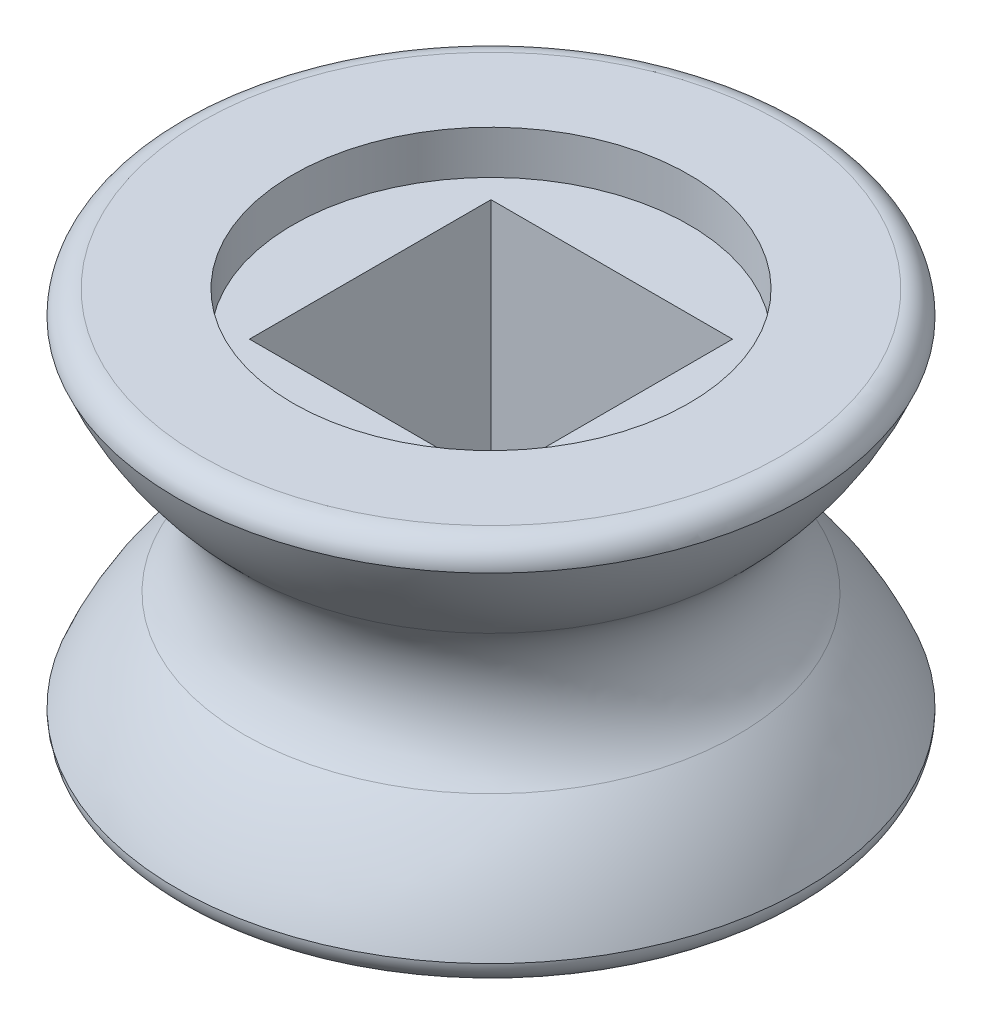
ISO-10303-21;
HEADER;
FILE_DESCRIPTION(('STEP AP214'),'2;1');
FILE_NAME('part.step','',(''),(''),'','','');
FILE_SCHEMA(('AUTOMOTIVE_DESIGN { 1 0 10303 214 1 1 1 1 }'));
ENDSEC;
DATA;
#1=APPLICATION_CONTEXT('core data for automotive mechanical design processes');
#2=APPLICATION_PROTOCOL_DEFINITION('international standard','automotive_design',2000,#1);
#3=PRODUCT_CONTEXT('',#1,'mechanical');
#4=PRODUCT('Part','Part','',(#3));
#5=PRODUCT_RELATED_PRODUCT_CATEGORY('part','',(#4));
#6=PRODUCT_DEFINITION_FORMATION('','',#4);
#7=PRODUCT_DEFINITION_CONTEXT('part definition',#1,'design');
#8=PRODUCT_DEFINITION('design','',#6,#7);
#9=PRODUCT_DEFINITION_SHAPE('','',#8);
#10=(LENGTH_UNIT() NAMED_UNIT(*) SI_UNIT(.MILLI.,.METRE.));
#11=(NAMED_UNIT(*) PLANE_ANGLE_UNIT() SI_UNIT($,.RADIAN.));
#12=(NAMED_UNIT(*) SI_UNIT($,.STERADIAN.) SOLID_ANGLE_UNIT());
#13=UNCERTAINTY_MEASURE_WITH_UNIT(LENGTH_MEASURE(1.E-05),#10,'distance_accuracy_value','');
#14=(GEOMETRIC_REPRESENTATION_CONTEXT(3) GLOBAL_UNCERTAINTY_ASSIGNED_CONTEXT((#13)) GLOBAL_UNIT_ASSIGNED_CONTEXT((#10,
#11,#12)) REPRESENTATION_CONTEXT('',''));
#15=CARTESIAN_POINT('',(0.,0.,0.));
#16=DIRECTION('',(0.,0.,1.));
#17=DIRECTION('',(1.,0.,0.));
#18=AXIS2_PLACEMENT_3D('',#15,#16,#17);
#19=CARTESIAN_POINT('',(3.175,-5.08,3.175));
#20=DIRECTION('',(1.,0.,0.));
#21=DIRECTION('',(0.,0.,-1.));
#22=AXIS2_PLACEMENT_3D('',#19,#20,#21);
#23=PLANE('',#22);
#24=DIRECTION('',(0.,0.,-1.));
#25=VECTOR('',#24,1.);
#26=CARTESIAN_POINT('',(3.175,-3.937,3.175));
#27=LINE('',#26,#25);
#28=CARTESIAN_POINT('',(3.175,-3.937,3.175));
#29=VERTEX_POINT('',#28);
#30=CARTESIAN_POINT('',(3.175,-3.937,-3.175));
#31=VERTEX_POINT('',#30);
#32=EDGE_CURVE('E58',#29,#31,#27,.T.);
#33=ORIENTED_EDGE('',*,*,#32,.F.);
#34=DIRECTION('',(0.,1.,0.));
#35=VECTOR('',#34,1.);
#36=CARTESIAN_POINT('',(3.175,-5.08,3.175));
#37=LINE('',#36,#35);
#38=CARTESIAN_POINT('',(3.175,3.937,3.175));
#39=VERTEX_POINT('',#38);
#40=EDGE_CURVE('E108',#29,#39,#37,.T.);
#41=ORIENTED_EDGE('',*,*,#40,.T.);
#42=DIRECTION('',(0.,0.,1.));
#43=VECTOR('',#42,1.);
#44=CARTESIAN_POINT('',(3.175,3.937,3.175));
#45=LINE('',#44,#43);
#46=CARTESIAN_POINT('',(3.175,3.937,-3.175));
#47=VERTEX_POINT('',#46);
#48=EDGE_CURVE('E110',#47,#39,#45,.T.);
#49=ORIENTED_EDGE('',*,*,#48,.F.);
#50=DIRECTION('',(0.,1.,0.));
#51=VECTOR('',#50,1.);
#52=CARTESIAN_POINT('',(3.175,-5.08,-3.175));
#53=LINE('',#52,#51);
#54=EDGE_CURVE('E104',#31,#47,#53,.T.);
#55=ORIENTED_EDGE('',*,*,#54,.F.);
#56=EDGE_LOOP('',(#33,#41,#49,#55));
#57=FACE_BOUND('',#56,.T.);
#58=ADVANCED_FACE('F42',(#57),#23,.F.);
#59=CARTESIAN_POINT('',(-3.175,-5.08,3.175));
#60=DIRECTION('',(0.,0.,1.));
#61=DIRECTION('',(1.,0.,0.));
#62=AXIS2_PLACEMENT_3D('',#59,#60,#61);
#63=PLANE('',#62);
#64=DIRECTION('',(1.,0.,0.));
#65=VECTOR('',#64,1.);
#66=CARTESIAN_POINT('',(-3.175,-3.937,3.175));
#67=LINE('',#66,#65);
#68=CARTESIAN_POINT('',(-3.175,-3.937,3.175));
#69=VERTEX_POINT('',#68);
#70=EDGE_CURVE('E97',#69,#29,#67,.T.);
#71=ORIENTED_EDGE('',*,*,#70,.F.);
#72=DIRECTION('',(0.,1.,0.));
#73=VECTOR('',#72,1.);
#74=CARTESIAN_POINT('',(-3.175,-5.08,3.175));
#75=LINE('',#74,#73);
#76=CARTESIAN_POINT('',(-3.175,3.937,3.175));
#77=VERTEX_POINT('',#76);
#78=EDGE_CURVE('E95',#69,#77,#75,.T.);
#79=ORIENTED_EDGE('',*,*,#78,.T.);
#80=DIRECTION('',(-1.,0.,0.));
#81=VECTOR('',#80,1.);
#82=CARTESIAN_POINT('',(-3.175,3.937,3.175));
#83=LINE('',#82,#81);
#84=EDGE_CURVE('E197',#39,#77,#83,.T.);
#85=ORIENTED_EDGE('',*,*,#84,.F.);
#86=ORIENTED_EDGE('',*,*,#40,.F.);
#87=EDGE_LOOP('',(#71,#79,#85,#86));
#88=FACE_BOUND('',#87,.T.);
#89=ADVANCED_FACE('F145',(#88),#63,.F.);
#90=CARTESIAN_POINT('',(-3.175,-5.08,3.175));
#91=DIRECTION('',(-1.,0.,0.));
#92=DIRECTION('',(0.,0.,1.));
#93=AXIS2_PLACEMENT_3D('',#90,#91,#92);
#94=PLANE('',#93);
#95=DIRECTION('',(0.,0.,1.));
#96=VECTOR('',#95,1.);
#97=CARTESIAN_POINT('',(-3.175,-3.937,3.175));
#98=LINE('',#97,#96);
#99=CARTESIAN_POINT('',(-3.175,-3.937,-3.175));
#100=VERTEX_POINT('',#99);
#101=EDGE_CURVE('E85',#100,#69,#98,.T.);
#102=ORIENTED_EDGE('',*,*,#101,.F.);
#103=DIRECTION('',(0.,1.,0.));
#104=VECTOR('',#103,1.);
#105=CARTESIAN_POINT('',(-3.175,-5.08,-3.175));
#106=LINE('',#105,#104);
#107=CARTESIAN_POINT('',(-3.175,3.937,-3.175));
#108=VERTEX_POINT('',#107);
#109=EDGE_CURVE('E66',#100,#108,#106,.T.);
#110=ORIENTED_EDGE('',*,*,#109,.T.);
#111=DIRECTION('',(0.,0.,-1.));
#112=VECTOR('',#111,1.);
#113=CARTESIAN_POINT('',(-3.175,3.937,3.175));
#114=LINE('',#113,#112);
#115=EDGE_CURVE('E191',#77,#108,#114,.T.);
#116=ORIENTED_EDGE('',*,*,#115,.F.);
#117=ORIENTED_EDGE('',*,*,#78,.F.);
#118=EDGE_LOOP('',(#102,#110,#116,#117));
#119=FACE_BOUND('',#118,.T.);
#120=ADVANCED_FACE('F94',(#119),#94,.F.);
#121=CARTESIAN_POINT('',(-3.175,-5.08,-3.175));
#122=DIRECTION('',(0.,0.,-1.));
#123=DIRECTION('',(-1.,0.,0.));
#124=AXIS2_PLACEMENT_3D('',#121,#122,#123);
#125=PLANE('',#124);
#126=DIRECTION('',(-1.,0.,0.));
#127=VECTOR('',#126,1.);
#128=CARTESIAN_POINT('',(-3.175,-3.937,-3.175));
#129=LINE('',#128,#127);
#130=EDGE_CURVE('E83',#31,#100,#129,.T.);
#131=ORIENTED_EDGE('',*,*,#130,.F.);
#132=ORIENTED_EDGE('',*,*,#54,.T.);
#133=DIRECTION('',(1.,0.,0.));
#134=VECTOR('',#133,1.);
#135=CARTESIAN_POINT('',(-3.175,3.937,-3.175));
#136=LINE('',#135,#134);
#137=EDGE_CURVE('E91',#108,#47,#136,.T.);
#138=ORIENTED_EDGE('',*,*,#137,.F.);
#139=ORIENTED_EDGE('',*,*,#109,.F.);
#140=EDGE_LOOP('',(#131,#132,#138,#139));
#141=FACE_BOUND('',#140,.T.);
#142=ADVANCED_FACE('F101',(#141),#125,.F.);
#143=CARTESIAN_POINT('',(8.255,-5.08,0.));
#144=DIRECTION('',(0.,-1.,0.));
#145=DIRECTION('',(0.,0.,-1.));
#146=AXIS2_PLACEMENT_3D('',#143,#144,#145);
#147=PLANE('',#146);
#148=CARTESIAN_POINT('',(0.,-5.08,0.));
#149=DIRECTION('',(0.,-1.,0.));
#150=DIRECTION('',(0.,0.,-1.));
#151=AXIS2_PLACEMENT_3D('',#148,#149,#150);
#152=CIRCLE('',#151,7.62);
#153=CARTESIAN_POINT('',(0.,-5.08,-7.62));
#154=VERTEX_POINT('',#153);
#155=EDGE_CURVE('E90',#154,#154,#152,.T.);
#156=ORIENTED_EDGE('',*,*,#155,.T.);
#157=EDGE_LOOP('',(#156));
#158=FACE_BOUND('',#157,.T.);
#159=CARTESIAN_POINT('',(0.,-5.08,0.));
#160=DIRECTION('',(0.,1.,0.));
#161=DIRECTION('',(0.,0.,1.));
#162=AXIS2_PLACEMENT_3D('',#159,#160,#161);
#163=CIRCLE('',#162,5.207);
#164=CARTESIAN_POINT('',(0.,-5.08,5.207));
#165=VERTEX_POINT('',#164);
#166=EDGE_CURVE('E211',#165,#165,#163,.T.);
#167=ORIENTED_EDGE('',*,*,#166,.T.);
#168=EDGE_LOOP('',(#167));
#169=FACE_BOUND('',#168,.T.);
#170=ADVANCED_FACE('F163',(#158,#169),#147,.T.);
#171=CARTESIAN_POINT('',(0.,0.,0.));
#172=DIRECTION('',(0.,-1.,0.));
#173=DIRECTION('',(0.,0.,-1.));
#174=AXIS2_PLACEMENT_3D('',#171,#172,#173);
#175=TOROIDAL_SURFACE('',#174,8.255,2.54);
#176=CARTESIAN_POINT('',(0.,-1.825625,0.));
#177=DIRECTION('',(0.,1.,0.));
#178=DIRECTION('',(0.,0.,1.));
#179=AXIS2_PLACEMENT_3D('',#176,#177,#178);
#180=CIRCLE('',#179,6.48901773526034);
#181=CARTESIAN_POINT('',(0.,-1.825625,6.48901773526034));
#182=VERTEX_POINT('',#181);
#183=EDGE_CURVE('E11',#182,#182,#180,.T.);
#184=ORIENTED_EDGE('',*,*,#183,.T.);
#185=EDGE_LOOP('',(#184));
#186=FACE_BOUND('',#185,.T.);
#187=CARTESIAN_POINT('',(0.,1.82562499999999,0.));
#188=DIRECTION('',(0.,-1.,0.));
#189=DIRECTION('',(0.,0.,-1.));
#190=AXIS2_PLACEMENT_3D('',#187,#188,#189);
#191=CIRCLE('',#190,6.48901773526035);
#192=CARTESIAN_POINT('',(0.,1.82562499999999,-6.48901773526035));
#193=VERTEX_POINT('',#192);
#194=EDGE_CURVE('E51',#193,#193,#191,.T.);
#195=ORIENTED_EDGE('',*,*,#194,.T.);
#196=EDGE_LOOP('',(#195));
#197=FACE_BOUND('',#196,.T.);
#198=ADVANCED_FACE('F134',(#186,#197),#175,.F.);
#199=CARTESIAN_POINT('',(8.255,5.08,0.));
#200=DIRECTION('',(0.,1.,0.));
#201=DIRECTION('',(0.,0.,1.));
#202=AXIS2_PLACEMENT_3D('',#199,#200,#201);
#203=PLANE('',#202);
#204=CARTESIAN_POINT('',(0.,5.08,0.));
#205=DIRECTION('',(0.,1.,0.));
#206=DIRECTION('',(0.,0.,1.));
#207=AXIS2_PLACEMENT_3D('',#204,#205,#206);
#208=CIRCLE('',#207,7.62);
#209=CARTESIAN_POINT('',(0.,5.08,7.62));
#210=VERTEX_POINT('',#209);
#211=EDGE_CURVE('E127',#210,#210,#208,.T.);
#212=ORIENTED_EDGE('',*,*,#211,.T.);
#213=EDGE_LOOP('',(#212));
#214=FACE_BOUND('',#213,.T.);
#215=CARTESIAN_POINT('',(0.,5.08,0.));
#216=DIRECTION('',(0.,1.,0.));
#217=DIRECTION('',(0.,0.,1.));
#218=AXIS2_PLACEMENT_3D('',#215,#216,#217);
#219=CIRCLE('',#218,5.207);
#220=CARTESIAN_POINT('',(0.,5.08,5.207));
#221=VERTEX_POINT('',#220);
#222=EDGE_CURVE('E183',#221,#221,#219,.T.);
#223=ORIENTED_EDGE('',*,*,#222,.F.);
#224=EDGE_LOOP('',(#223));
#225=FACE_BOUND('',#224,.T.);
#226=ADVANCED_FACE('F156',(#214,#225),#203,.T.);
#227=CARTESIAN_POINT('',(0.,3.937,0.));
#228=DIRECTION('',(0.,1.,0.));
#229=DIRECTION('',(0.,0.,1.));
#230=AXIS2_PLACEMENT_3D('',#227,#228,#229);
#231=PLANE('',#230);
#232=CARTESIAN_POINT('',(0.,3.937,0.));
#233=DIRECTION('',(0.,1.,0.));
#234=DIRECTION('',(0.,0.,1.));
#235=AXIS2_PLACEMENT_3D('',#232,#233,#234);
#236=CIRCLE('',#235,5.207);
#237=CARTESIAN_POINT('',(0.,3.937,5.207));
#238=VERTEX_POINT('',#237);
#239=EDGE_CURVE('E186',#238,#238,#236,.T.);
#240=ORIENTED_EDGE('',*,*,#239,.T.);
#241=EDGE_LOOP('',(#240));
#242=FACE_BOUND('',#241,.T.);
#243=ORIENTED_EDGE('',*,*,#48,.T.);
#244=ORIENTED_EDGE('',*,*,#84,.T.);
#245=ORIENTED_EDGE('',*,*,#115,.T.);
#246=ORIENTED_EDGE('',*,*,#137,.T.);
#247=EDGE_LOOP('',(#243,#244,#245,#246));
#248=FACE_BOUND('',#247,.T.);
#249=ADVANCED_FACE('F159',(#242,#248),#231,.T.);
#250=CARTESIAN_POINT('',(0.,3.937,0.));
#251=DIRECTION('',(0.,1.,0.));
#252=DIRECTION('',(0.,0.,1.));
#253=AXIS2_PLACEMENT_3D('',#250,#251,#252);
#254=CYLINDRICAL_SURFACE('',#253,5.207);
#255=ORIENTED_EDGE('',*,*,#239,.F.);
#256=EDGE_LOOP('',(#255));
#257=FACE_BOUND('',#256,.T.);
#258=ORIENTED_EDGE('',*,*,#222,.T.);
#259=EDGE_LOOP('',(#258));
#260=FACE_BOUND('',#259,.T.);
#261=ADVANCED_FACE('F222',(#257,#260),#254,.F.);
#262=CARTESIAN_POINT('',(0.,-3.937,0.));
#263=DIRECTION('',(0.,-1.,0.));
#264=DIRECTION('',(0.,0.,1.));
#265=AXIS2_PLACEMENT_3D('',#262,#263,#264);
#266=PLANE('',#265);
#267=CARTESIAN_POINT('',(0.,-3.937,0.));
#268=DIRECTION('',(0.,1.,0.));
#269=DIRECTION('',(0.,0.,1.));
#270=AXIS2_PLACEMENT_3D('',#267,#268,#269);
#271=CIRCLE('',#270,5.207);
#272=CARTESIAN_POINT('',(0.,-3.937,5.207));
#273=VERTEX_POINT('',#272);
#274=EDGE_CURVE('E98',#273,#273,#271,.T.);
#275=ORIENTED_EDGE('',*,*,#274,.F.);
#276=EDGE_LOOP('',(#275));
#277=FACE_BOUND('',#276,.T.);
#278=ORIENTED_EDGE('',*,*,#32,.T.);
#279=ORIENTED_EDGE('',*,*,#130,.T.);
#280=ORIENTED_EDGE('',*,*,#101,.T.);
#281=ORIENTED_EDGE('',*,*,#70,.T.);
#282=EDGE_LOOP('',(#278,#279,#280,#281));
#283=FACE_BOUND('',#282,.T.);
#284=ADVANCED_FACE('F84',(#277,#283),#266,.T.);
#285=CARTESIAN_POINT('',(0.,-3.937,0.));
#286=DIRECTION('',(0.,-1.,0.));
#287=DIRECTION('',(0.,0.,-1.));
#288=AXIS2_PLACEMENT_3D('',#285,#286,#287);
#289=CYLINDRICAL_SURFACE('',#288,5.207);
#290=ORIENTED_EDGE('',*,*,#274,.T.);
#291=EDGE_LOOP('',(#290));
#292=FACE_BOUND('',#291,.T.);
#293=ORIENTED_EDGE('',*,*,#166,.F.);
#294=EDGE_LOOP('',(#293));
#295=FACE_BOUND('',#294,.T.);
#296=ADVANCED_FACE('F171',(#292,#295),#289,.F.);
#297=CARTESIAN_POINT('',(0.,-4.445,0.));
#298=DIRECTION('',(0.,-1.,0.));
#299=DIRECTION('',(0.,0.,-1.));
#300=AXIS2_PLACEMENT_3D('',#297,#298,#299);
#301=TOROIDAL_SURFACE('',#300,7.62,0.635);
#302=CARTESIAN_POINT('',(0.,-4.445,0.));
#303=DIRECTION('',(0.,-1.,0.));
#304=DIRECTION('',(0.,0.,-1.));
#305=AXIS2_PLACEMENT_3D('',#302,#303,#304);
#306=CIRCLE('',#305,8.255);
#307=CARTESIAN_POINT('',(0.,-4.445,-8.255));
#308=VERTEX_POINT('',#307);
#309=EDGE_CURVE('E119',#308,#308,#306,.F.);
#310=ORIENTED_EDGE('',*,*,#309,.F.);
#311=EDGE_LOOP('',(#310));
#312=FACE_BOUND('',#311,.T.);
#313=ORIENTED_EDGE('',*,*,#155,.F.);
#314=EDGE_LOOP('',(#313));
#315=FACE_BOUND('',#314,.T.);
#316=ADVANCED_FACE('F168',(#312,#315),#301,.T.);
#317=CARTESIAN_POINT('',(0.,4.445,0.));
#318=DIRECTION('',(0.,1.,0.));
#319=DIRECTION('',(0.,0.,1.));
#320=AXIS2_PLACEMENT_3D('',#317,#318,#319);
#321=TOROIDAL_SURFACE('',#320,7.62,0.635);
#322=ORIENTED_EDGE('',*,*,#211,.F.);
#323=EDGE_LOOP('',(#322));
#324=FACE_BOUND('',#323,.T.);
#325=CARTESIAN_POINT('',(0.,4.445,0.));
#326=DIRECTION('',(0.,1.,0.));
#327=DIRECTION('',(0.,0.,1.));
#328=AXIS2_PLACEMENT_3D('',#325,#326,#327);
#329=CIRCLE('',#328,8.255);
#330=CARTESIAN_POINT('',(0.,4.445,8.255));
#331=VERTEX_POINT('',#330);
#332=EDGE_CURVE('E123',#331,#331,#329,.F.);
#333=ORIENTED_EDGE('',*,*,#332,.F.);
#334=EDGE_LOOP('',(#333));
#335=FACE_BOUND('',#334,.T.);
#336=ADVANCED_FACE('F142',(#324,#335),#321,.T.);
#337=CARTESIAN_POINT('',(0.,-7.3025,0.));
#338=DIRECTION('',(0.,-1.,0.));
#339=DIRECTION('',(0.,0.,-1.));
#340=AXIS2_PLACEMENT_3D('',#337,#338,#339);
#341=DEGENERATE_TOROIDAL_SURFACE('',#340,1.19107094104138,7.62,.T.);
#342=ORIENTED_EDGE('',*,*,#183,.F.);
#343=EDGE_LOOP('',(#342));
#344=FACE_BOUND('',#343,.T.);
#345=ORIENTED_EDGE('',*,*,#309,.T.);
#346=EDGE_LOOP('',(#345));
#347=FACE_BOUND('',#346,.T.);
#348=ADVANCED_FACE('F137',(#344,#347),#341,.T.);
#349=CARTESIAN_POINT('',(0.,7.3025,0.));
#350=DIRECTION('',(0.,-1.,0.));
#351=DIRECTION('',(0.,0.,-1.));
#352=AXIS2_PLACEMENT_3D('',#349,#350,#351);
#353=DEGENERATE_TOROIDAL_SURFACE('',#352,1.19107094104138,7.62,.T.);
#354=ORIENTED_EDGE('',*,*,#332,.T.);
#355=EDGE_LOOP('',(#354));
#356=FACE_BOUND('',#355,.T.);
#357=ORIENTED_EDGE('',*,*,#194,.F.);
#358=EDGE_LOOP('',(#357));
#359=FACE_BOUND('',#358,.T.);
#360=ADVANCED_FACE('F44',(#356,#359),#353,.T.);
#361=CLOSED_SHELL('',(#58,#89,#120,#142,#170,#198,#226,#249,#261,#284,#296,#316,#336,#348,#360));
#362=MANIFOLD_SOLID_BREP('B2',#361);
#363=ADVANCED_BREP_SHAPE_REPRESENTATION('',(#18,#362),#14);
#364=SHAPE_DEFINITION_REPRESENTATION(#9,#363);
ENDSEC;
END-ISO-10303-21;
